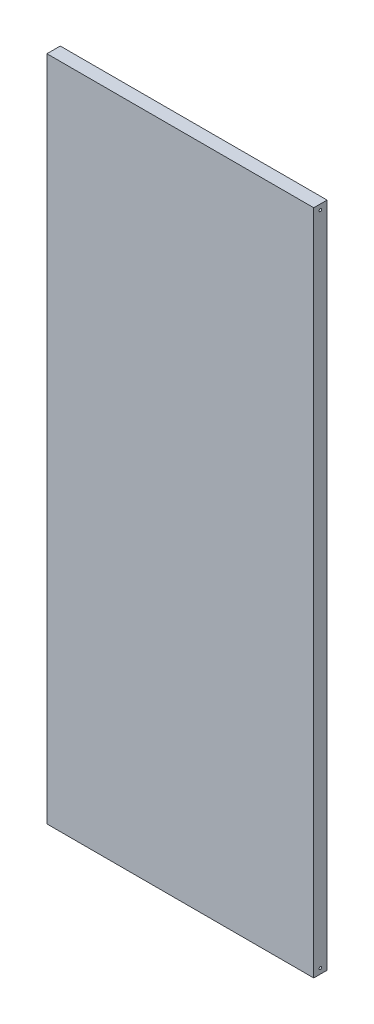
ISO-10303-21;
HEADER;
FILE_DESCRIPTION(('STEP AP214'),'2;1');
FILE_NAME('part.step','',(''),(''),'','','');
FILE_SCHEMA(('AUTOMOTIVE_DESIGN { 1 0 10303 214 1 1 1 1 }'));
ENDSEC;
DATA;
#1=APPLICATION_CONTEXT('core data for automotive mechanical design processes');
#2=APPLICATION_PROTOCOL_DEFINITION('international standard','automotive_design',2000,#1);
#3=PRODUCT_CONTEXT('',#1,'mechanical');
#4=PRODUCT('Part','Part','',(#3));
#5=PRODUCT_RELATED_PRODUCT_CATEGORY('part','',(#4));
#6=PRODUCT_DEFINITION_FORMATION('','',#4);
#7=PRODUCT_DEFINITION_CONTEXT('part definition',#1,'design');
#8=PRODUCT_DEFINITION('design','',#6,#7);
#9=PRODUCT_DEFINITION_SHAPE('','',#8);
#10=(LENGTH_UNIT() NAMED_UNIT(*) SI_UNIT(.MILLI.,.METRE.));
#11=(NAMED_UNIT(*) PLANE_ANGLE_UNIT() SI_UNIT($,.RADIAN.));
#12=(NAMED_UNIT(*) SI_UNIT($,.STERADIAN.) SOLID_ANGLE_UNIT());
#13=UNCERTAINTY_MEASURE_WITH_UNIT(LENGTH_MEASURE(1.E-05),#10,'distance_accuracy_value','');
#14=(GEOMETRIC_REPRESENTATION_CONTEXT(3) GLOBAL_UNCERTAINTY_ASSIGNED_CONTEXT((#13)) GLOBAL_UNIT_ASSIGNED_CONTEXT((#10,
#11,#12)) REPRESENTATION_CONTEXT('',''));
#15=CARTESIAN_POINT('',(0.,0.,0.));
#16=DIRECTION('',(0.,0.,1.));
#17=DIRECTION('',(1.,0.,0.));
#18=AXIS2_PLACEMENT_3D('',#15,#16,#17);
#19=CARTESIAN_POINT('',(-17.9705,6.2865,0.254));
#20=DIRECTION('',(-1.,0.,0.));
#21=DIRECTION('',(0.,-1.,0.));
#22=AXIS2_PLACEMENT_3D('',#19,#20,#21);
#23=PLANE('',#22);
#24=CARTESIAN_POINT('',(-17.9705,6.1849,0.127));
#25=DIRECTION('',(1.,0.,0.));
#26=DIRECTION('',(0.,1.,0.));
#27=AXIS2_PLACEMENT_3D('',#24,#25,#26);
#28=CIRCLE('',#27,0.0253999999999994);
#29=CARTESIAN_POINT('',(-17.9705,6.2103,0.127));
#30=VERTEX_POINT('',#29);
#31=EDGE_CURVE('E144',#30,#30,#28,.T.);
#32=ORIENTED_EDGE('',*,*,#31,.F.);
#33=EDGE_LOOP('',(#32));
#34=FACE_BOUND('',#33,.T.);
#35=CARTESIAN_POINT('',(-17.9705,-6.3119,0.127));
#36=DIRECTION('',(1.,0.,0.));
#37=DIRECTION('',(0.,1.,0.));
#38=AXIS2_PLACEMENT_3D('',#35,#36,#37);
#39=CIRCLE('',#38,0.0254000000000002);
#40=CARTESIAN_POINT('',(-17.9705,-6.2865,0.127));
#41=VERTEX_POINT('',#40);
#42=EDGE_CURVE('E137',#41,#41,#39,.T.);
#43=ORIENTED_EDGE('',*,*,#42,.F.);
#44=EDGE_LOOP('',(#43));
#45=FACE_BOUND('',#44,.T.);
#46=DIRECTION('',(0.,1.,0.));
#47=VECTOR('',#46,1.);
#48=CARTESIAN_POINT('',(-17.9705,6.2865,0.));
#49=LINE('',#48,#47);
#50=CARTESIAN_POINT('',(-17.9705,-6.4135,0.));
#51=VERTEX_POINT('',#50);
#52=CARTESIAN_POINT('',(-17.9705,6.2865,0.));
#53=VERTEX_POINT('',#52);
#54=EDGE_CURVE('E115',#51,#53,#49,.T.);
#55=ORIENTED_EDGE('',*,*,#54,.T.);
#56=DIRECTION('',(0.,0.,-1.));
#57=VECTOR('',#56,1.);
#58=CARTESIAN_POINT('',(-17.9705,6.2865,0.254));
#59=LINE('',#58,#57);
#60=CARTESIAN_POINT('',(-17.9705,6.2865,0.254));
#61=VERTEX_POINT('',#60);
#62=EDGE_CURVE('E11',#61,#53,#59,.T.);
#63=ORIENTED_EDGE('',*,*,#62,.F.);
#64=DIRECTION('',(0.,1.,0.));
#65=VECTOR('',#64,1.);
#66=CARTESIAN_POINT('',(-17.9705,6.2865,0.254));
#67=LINE('',#66,#65);
#68=CARTESIAN_POINT('',(-17.9705,-6.4135,0.254));
#69=VERTEX_POINT('',#68);
#70=EDGE_CURVE('E98',#69,#61,#67,.T.);
#71=ORIENTED_EDGE('',*,*,#70,.F.);
#72=DIRECTION('',(0.,0.,-1.));
#73=VECTOR('',#72,1.);
#74=CARTESIAN_POINT('',(-17.9705,-6.4135,0.254));
#75=LINE('',#74,#73);
#76=EDGE_CURVE('E111',#69,#51,#75,.T.);
#77=ORIENTED_EDGE('',*,*,#76,.T.);
#78=EDGE_LOOP('',(#55,#63,#71,#77));
#79=FACE_BOUND('',#78,.T.);
#80=ADVANCED_FACE('F38',(#34,#45,#79),#23,.F.);
#81=CARTESIAN_POINT('',(-23.0505,6.2865,0.254));
#82=DIRECTION('',(0.,-1.,0.));
#83=DIRECTION('',(0.,0.,-1.));
#84=AXIS2_PLACEMENT_3D('',#81,#82,#83);
#85=PLANE('',#84);
#86=DIRECTION('',(-1.,0.,0.));
#87=VECTOR('',#86,1.);
#88=CARTESIAN_POINT('',(-23.0505,6.2865,0.));
#89=LINE('',#88,#87);
#90=CARTESIAN_POINT('',(-23.0505,6.2865,0.));
#91=VERTEX_POINT('',#90);
#92=EDGE_CURVE('E103',#53,#91,#89,.T.);
#93=ORIENTED_EDGE('',*,*,#92,.T.);
#94=DIRECTION('',(0.,0.,-1.));
#95=VECTOR('',#94,1.);
#96=CARTESIAN_POINT('',(-23.0505,6.2865,0.254));
#97=LINE('',#96,#95);
#98=CARTESIAN_POINT('',(-23.0505,6.2865,0.254));
#99=VERTEX_POINT('',#98);
#100=EDGE_CURVE('E47',#99,#91,#97,.T.);
#101=ORIENTED_EDGE('',*,*,#100,.F.);
#102=DIRECTION('',(-1.,0.,0.));
#103=VECTOR('',#102,1.);
#104=CARTESIAN_POINT('',(-23.0505,6.2865,0.254));
#105=LINE('',#104,#103);
#106=EDGE_CURVE('E93',#61,#99,#105,.T.);
#107=ORIENTED_EDGE('',*,*,#106,.F.);
#108=ORIENTED_EDGE('',*,*,#62,.T.);
#109=EDGE_LOOP('',(#93,#101,#107,#108));
#110=FACE_BOUND('',#109,.T.);
#111=ADVANCED_FACE('F102',(#110),#85,.F.);
#112=CARTESIAN_POINT('',(-23.0505,6.2865,0.254));
#113=DIRECTION('',(1.,0.,0.));
#114=DIRECTION('',(0.,1.,0.));
#115=AXIS2_PLACEMENT_3D('',#112,#113,#114);
#116=PLANE('',#115);
#117=CARTESIAN_POINT('',(-23.0505,6.1849,0.127));
#118=DIRECTION('',(1.,0.,0.));
#119=DIRECTION('',(0.,1.,0.));
#120=AXIS2_PLACEMENT_3D('',#117,#118,#119);
#121=CIRCLE('',#120,0.0253999999999994);
#122=CARTESIAN_POINT('',(-23.0505,6.2103,0.127));
#123=VERTEX_POINT('',#122);
#124=EDGE_CURVE('E119',#123,#123,#121,.T.);
#125=ORIENTED_EDGE('',*,*,#124,.T.);
#126=EDGE_LOOP('',(#125));
#127=FACE_BOUND('',#126,.T.);
#128=CARTESIAN_POINT('',(-23.0505,-6.3119,0.127));
#129=DIRECTION('',(1.,0.,0.));
#130=DIRECTION('',(0.,1.,0.));
#131=AXIS2_PLACEMENT_3D('',#128,#129,#130);
#132=CIRCLE('',#131,0.0254000000000002);
#133=CARTESIAN_POINT('',(-23.0505,-6.2865,0.127));
#134=VERTEX_POINT('',#133);
#135=EDGE_CURVE('E140',#134,#134,#132,.T.);
#136=ORIENTED_EDGE('',*,*,#135,.T.);
#137=EDGE_LOOP('',(#136));
#138=FACE_BOUND('',#137,.T.);
#139=DIRECTION('',(0.,-1.,0.));
#140=VECTOR('',#139,1.);
#141=CARTESIAN_POINT('',(-23.0505,6.2865,0.));
#142=LINE('',#141,#140);
#143=CARTESIAN_POINT('',(-23.0505,-6.4135,0.));
#144=VERTEX_POINT('',#143);
#145=EDGE_CURVE('E78',#91,#144,#142,.T.);
#146=ORIENTED_EDGE('',*,*,#145,.T.);
#147=DIRECTION('',(0.,0.,-1.));
#148=VECTOR('',#147,1.);
#149=CARTESIAN_POINT('',(-23.0505,-6.4135,0.254));
#150=LINE('',#149,#148);
#151=CARTESIAN_POINT('',(-23.0505,-6.4135,0.254));
#152=VERTEX_POINT('',#151);
#153=EDGE_CURVE('E105',#152,#144,#150,.T.);
#154=ORIENTED_EDGE('',*,*,#153,.F.);
#155=DIRECTION('',(0.,-1.,0.));
#156=VECTOR('',#155,1.);
#157=CARTESIAN_POINT('',(-23.0505,6.2865,0.254));
#158=LINE('',#157,#156);
#159=EDGE_CURVE('E96',#99,#152,#158,.T.);
#160=ORIENTED_EDGE('',*,*,#159,.F.);
#161=ORIENTED_EDGE('',*,*,#100,.T.);
#162=EDGE_LOOP('',(#146,#154,#160,#161));
#163=FACE_BOUND('',#162,.T.);
#164=ADVANCED_FACE('F106',(#127,#138,#163),#116,.F.);
#165=CARTESIAN_POINT('',(-23.0505,-6.4135,0.254));
#166=DIRECTION('',(0.,1.,0.));
#167=DIRECTION('',(0.,0.,1.));
#168=AXIS2_PLACEMENT_3D('',#165,#166,#167);
#169=PLANE('',#168);
#170=DIRECTION('',(1.,0.,0.));
#171=VECTOR('',#170,1.);
#172=CARTESIAN_POINT('',(-23.0505,-6.4135,0.));
#173=LINE('',#172,#171);
#174=EDGE_CURVE('E85',#144,#51,#173,.T.);
#175=ORIENTED_EDGE('',*,*,#174,.T.);
#176=ORIENTED_EDGE('',*,*,#76,.F.);
#177=DIRECTION('',(1.,0.,0.));
#178=VECTOR('',#177,1.);
#179=CARTESIAN_POINT('',(-23.0505,-6.4135,0.254));
#180=LINE('',#179,#178);
#181=EDGE_CURVE('E58',#152,#69,#180,.T.);
#182=ORIENTED_EDGE('',*,*,#181,.F.);
#183=ORIENTED_EDGE('',*,*,#153,.T.);
#184=EDGE_LOOP('',(#175,#176,#182,#183));
#185=FACE_BOUND('',#184,.T.);
#186=ADVANCED_FACE('F129',(#185),#169,.F.);
#187=CARTESIAN_POINT('',(0.,0.,0.254));
#188=DIRECTION('',(0.,0.,1.));
#189=DIRECTION('',(1.,0.,0.));
#190=AXIS2_PLACEMENT_3D('',#187,#188,#189);
#191=PLANE('',#190);
#192=ORIENTED_EDGE('',*,*,#70,.T.);
#193=ORIENTED_EDGE('',*,*,#106,.T.);
#194=ORIENTED_EDGE('',*,*,#159,.T.);
#195=ORIENTED_EDGE('',*,*,#181,.T.);
#196=EDGE_LOOP('',(#192,#193,#194,#195));
#197=FACE_BOUND('',#196,.T.);
#198=ADVANCED_FACE('F94',(#197),#191,.T.);
#199=CARTESIAN_POINT('',(0.,0.,0.));
#200=DIRECTION('',(0.,0.,1.));
#201=DIRECTION('',(1.,0.,0.));
#202=AXIS2_PLACEMENT_3D('',#199,#200,#201);
#203=PLANE('',#202);
#204=ORIENTED_EDGE('',*,*,#54,.F.);
#205=ORIENTED_EDGE('',*,*,#174,.F.);
#206=ORIENTED_EDGE('',*,*,#145,.F.);
#207=ORIENTED_EDGE('',*,*,#92,.F.);
#208=EDGE_LOOP('',(#204,#205,#206,#207));
#209=FACE_BOUND('',#208,.T.);
#210=ADVANCED_FACE('F132',(#209),#203,.F.);
#211=CARTESIAN_POINT('',(-23.0505,-6.3119,0.127));
#212=DIRECTION('',(1.,0.,0.));
#213=DIRECTION('',(0.,1.,0.));
#214=AXIS2_PLACEMENT_3D('',#211,#212,#213);
#215=CYLINDRICAL_SURFACE('',#214,0.0254000000000002);
#216=ORIENTED_EDGE('',*,*,#135,.F.);
#217=EDGE_LOOP('',(#216));
#218=FACE_BOUND('',#217,.T.);
#219=ORIENTED_EDGE('',*,*,#42,.T.);
#220=EDGE_LOOP('',(#219));
#221=FACE_BOUND('',#220,.T.);
#222=ADVANCED_FACE('F156',(#218,#221),#215,.F.);
#223=CARTESIAN_POINT('',(-23.0505,6.1849,0.127));
#224=DIRECTION('',(1.,0.,0.));
#225=DIRECTION('',(0.,1.,0.));
#226=AXIS2_PLACEMENT_3D('',#223,#224,#225);
#227=CYLINDRICAL_SURFACE('',#226,0.0253999999999994);
#228=ORIENTED_EDGE('',*,*,#124,.F.);
#229=EDGE_LOOP('',(#228));
#230=FACE_BOUND('',#229,.T.);
#231=ORIENTED_EDGE('',*,*,#31,.T.);
#232=EDGE_LOOP('',(#231));
#233=FACE_BOUND('',#232,.T.);
#234=ADVANCED_FACE('F153',(#230,#233),#227,.F.);
#235=CLOSED_SHELL('',(#80,#111,#164,#186,#198,#210,#222,#234));
#236=MANIFOLD_SOLID_BREP('B2',#235);
#237=ADVANCED_BREP_SHAPE_REPRESENTATION('',(#18,#236),#14);
#238=SHAPE_DEFINITION_REPRESENTATION(#9,#237);
ENDSEC;
END-ISO-10303-21;
